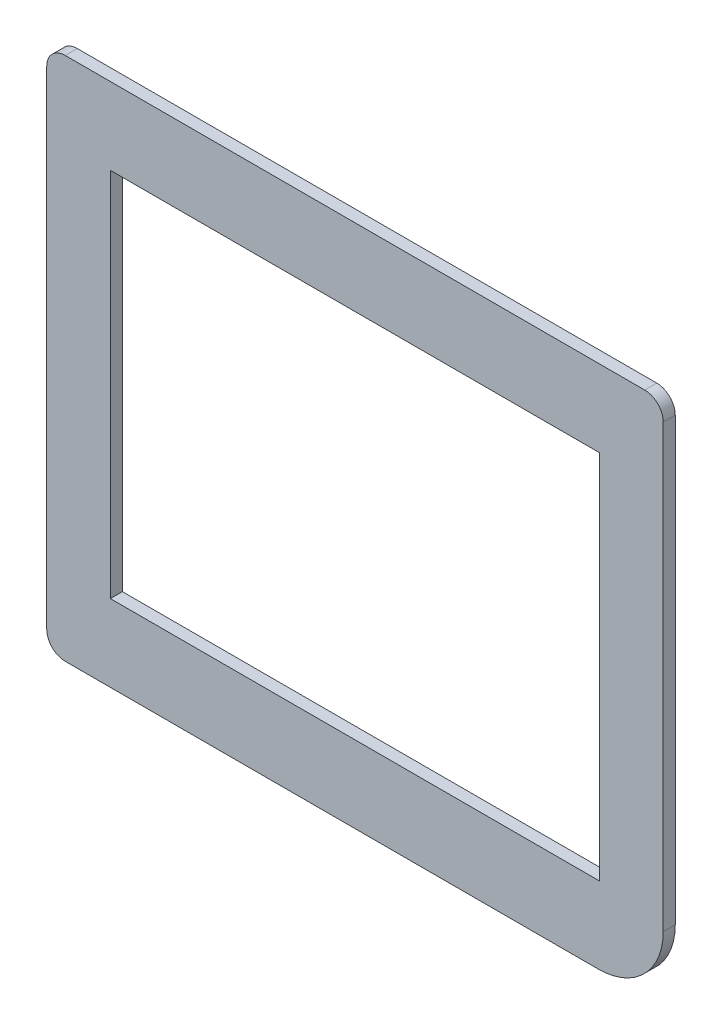
ISO-10303-21;
HEADER;
FILE_DESCRIPTION(('STEP AP214'),'2;1');
FILE_NAME('part.step','',(''),(''),'','','');
FILE_SCHEMA(('AUTOMOTIVE_DESIGN { 1 0 10303 214 1 1 1 1 }'));
ENDSEC;
DATA;
#1=APPLICATION_CONTEXT('core data for automotive mechanical design processes');
#2=APPLICATION_PROTOCOL_DEFINITION('international standard','automotive_design',2000,#1);
#3=PRODUCT_CONTEXT('',#1,'mechanical');
#4=PRODUCT('Part','Part','',(#3));
#5=PRODUCT_RELATED_PRODUCT_CATEGORY('part','',(#4));
#6=PRODUCT_DEFINITION_FORMATION('','',#4);
#7=PRODUCT_DEFINITION_CONTEXT('part definition',#1,'design');
#8=PRODUCT_DEFINITION('design','',#6,#7);
#9=PRODUCT_DEFINITION_SHAPE('','',#8);
#10=(LENGTH_UNIT() NAMED_UNIT(*) SI_UNIT(.MILLI.,.METRE.));
#11=(NAMED_UNIT(*) PLANE_ANGLE_UNIT() SI_UNIT($,.RADIAN.));
#12=(NAMED_UNIT(*) SI_UNIT($,.STERADIAN.) SOLID_ANGLE_UNIT());
#13=UNCERTAINTY_MEASURE_WITH_UNIT(LENGTH_MEASURE(1.E-05),#10,'distance_accuracy_value','');
#14=(GEOMETRIC_REPRESENTATION_CONTEXT(3) GLOBAL_UNCERTAINTY_ASSIGNED_CONTEXT((#13)) GLOBAL_UNIT_ASSIGNED_CONTEXT((#10,
#11,#12)) REPRESENTATION_CONTEXT('',''));
#15=CARTESIAN_POINT('',(0.,0.,0.));
#16=DIRECTION('',(0.,0.,1.));
#17=DIRECTION('',(1.,0.,0.));
#18=AXIS2_PLACEMENT_3D('',#15,#16,#17);
#19=CARTESIAN_POINT('',(26.31,-21.35,1.3));
#20=DIRECTION('',(0.,0.,-1.));
#21=DIRECTION('',(-1.,0.,0.));
#22=AXIS2_PLACEMENT_3D('',#19,#20,#21);
#23=CYLINDRICAL_SURFACE('',#22,7.);
#24=CARTESIAN_POINT('',(26.31,-21.35,0.));
#25=DIRECTION('',(0.,0.,1.));
#26=DIRECTION('',(1.,0.,0.));
#27=AXIS2_PLACEMENT_3D('',#24,#25,#26);
#28=CIRCLE('',#27,7.);
#29=CARTESIAN_POINT('',(26.31,-28.35,0.));
#30=VERTEX_POINT('',#29);
#31=CARTESIAN_POINT('',(33.31,-21.35,0.));
#32=VERTEX_POINT('',#31);
#33=EDGE_CURVE('E154',#30,#32,#28,.T.);
#34=ORIENTED_EDGE('',*,*,#33,.T.);
#35=DIRECTION('',(0.,0.,-1.));
#36=VECTOR('',#35,1.);
#37=CARTESIAN_POINT('',(33.31,-21.35,1.3));
#38=LINE('',#37,#36);
#39=CARTESIAN_POINT('',(33.31,-21.35,1.3));
#40=VERTEX_POINT('',#39);
#41=EDGE_CURVE('E11',#40,#32,#38,.T.);
#42=ORIENTED_EDGE('',*,*,#41,.F.);
#43=CARTESIAN_POINT('',(26.31,-21.35,1.3));
#44=DIRECTION('',(0.,0.,1.));
#45=DIRECTION('',(1.,0.,0.));
#46=AXIS2_PLACEMENT_3D('',#43,#44,#45);
#47=CIRCLE('',#46,7.);
#48=CARTESIAN_POINT('',(26.31,-28.35,1.3));
#49=VERTEX_POINT('',#48);
#50=EDGE_CURVE('E158',#49,#40,#47,.T.);
#51=ORIENTED_EDGE('',*,*,#50,.F.);
#52=DIRECTION('',(0.,0.,-1.));
#53=VECTOR('',#52,1.);
#54=CARTESIAN_POINT('',(26.31,-28.35,1.3));
#55=LINE('',#54,#53);
#56=EDGE_CURVE('E176',#49,#30,#55,.T.);
#57=ORIENTED_EDGE('',*,*,#56,.T.);
#58=EDGE_LOOP('',(#34,#42,#51,#57));
#59=FACE_BOUND('',#58,.T.);
#60=ADVANCED_FACE('F33',(#59),#23,.T.);
#61=CARTESIAN_POINT('',(33.31,26.35,1.3));
#62=DIRECTION('',(-1.,0.,0.));
#63=DIRECTION('',(0.,-1.,0.));
#64=AXIS2_PLACEMENT_3D('',#61,#62,#63);
#65=PLANE('',#64);
#66=DIRECTION('',(0.,1.,0.));
#67=VECTOR('',#66,1.);
#68=CARTESIAN_POINT('',(33.31,26.35,0.));
#69=LINE('',#68,#67);
#70=CARTESIAN_POINT('',(33.31,26.35,0.));
#71=VERTEX_POINT('',#70);
#72=EDGE_CURVE('E179',#32,#71,#69,.T.);
#73=ORIENTED_EDGE('',*,*,#72,.T.);
#74=DIRECTION('',(0.,0.,-1.));
#75=VECTOR('',#74,1.);
#76=CARTESIAN_POINT('',(33.31,26.35,1.3));
#77=LINE('',#76,#75);
#78=CARTESIAN_POINT('',(33.31,26.35,1.3));
#79=VERTEX_POINT('',#78);
#80=EDGE_CURVE('E40',#79,#71,#77,.T.);
#81=ORIENTED_EDGE('',*,*,#80,.F.);
#82=DIRECTION('',(0.,1.,0.));
#83=VECTOR('',#82,1.);
#84=CARTESIAN_POINT('',(33.31,26.35,1.3));
#85=LINE('',#84,#83);
#86=EDGE_CURVE('E161',#40,#79,#85,.T.);
#87=ORIENTED_EDGE('',*,*,#86,.F.);
#88=ORIENTED_EDGE('',*,*,#41,.T.);
#89=EDGE_LOOP('',(#73,#81,#87,#88));
#90=FACE_BOUND('',#89,.T.);
#91=ADVANCED_FACE('F234',(#90),#65,.F.);
#92=CARTESIAN_POINT('',(31.31,26.35,1.3));
#93=DIRECTION('',(0.,0.,-1.));
#94=DIRECTION('',(-1.,0.,0.));
#95=AXIS2_PLACEMENT_3D('',#92,#93,#94);
#96=CYLINDRICAL_SURFACE('',#95,2.00000000000001);
#97=CARTESIAN_POINT('',(31.31,26.35,0.));
#98=DIRECTION('',(0.,0.,1.));
#99=DIRECTION('',(-1.,0.,0.));
#100=AXIS2_PLACEMENT_3D('',#97,#98,#99);
#101=CIRCLE('',#100,2.00000000000001);
#102=CARTESIAN_POINT('',(31.31,28.35,0.));
#103=VERTEX_POINT('',#102);
#104=EDGE_CURVE('E181',#71,#103,#101,.T.);
#105=ORIENTED_EDGE('',*,*,#104,.T.);
#106=DIRECTION('',(0.,0.,-1.));
#107=VECTOR('',#106,1.);
#108=CARTESIAN_POINT('',(31.31,28.35,1.3));
#109=LINE('',#108,#107);
#110=CARTESIAN_POINT('',(31.31,28.35,1.3));
#111=VERTEX_POINT('',#110);
#112=EDGE_CURVE('E206',#111,#103,#109,.T.);
#113=ORIENTED_EDGE('',*,*,#112,.F.);
#114=CARTESIAN_POINT('',(31.31,26.35,1.3));
#115=DIRECTION('',(0.,0.,1.));
#116=DIRECTION('',(-1.,0.,0.));
#117=AXIS2_PLACEMENT_3D('',#114,#115,#116);
#118=CIRCLE('',#117,2.00000000000001);
#119=EDGE_CURVE('E164',#79,#111,#118,.T.);
#120=ORIENTED_EDGE('',*,*,#119,.F.);
#121=ORIENTED_EDGE('',*,*,#80,.T.);
#122=EDGE_LOOP('',(#105,#113,#120,#121));
#123=FACE_BOUND('',#122,.T.);
#124=ADVANCED_FACE('F213',(#123),#96,.T.);
#125=CARTESIAN_POINT('',(-31.31,28.35,1.3));
#126=DIRECTION('',(0.,-1.,0.));
#127=DIRECTION('',(1.,0.,0.));
#128=AXIS2_PLACEMENT_3D('',#125,#126,#127);
#129=PLANE('',#128);
#130=DIRECTION('',(-1.,0.,0.));
#131=VECTOR('',#130,1.);
#132=CARTESIAN_POINT('',(-31.31,28.35,0.));
#133=LINE('',#132,#131);
#134=CARTESIAN_POINT('',(-31.31,28.35,0.));
#135=VERTEX_POINT('',#134);
#136=EDGE_CURVE('E183',#103,#135,#133,.T.);
#137=ORIENTED_EDGE('',*,*,#136,.T.);
#138=DIRECTION('',(0.,0.,-1.));
#139=VECTOR('',#138,1.);
#140=CARTESIAN_POINT('',(-31.31,28.35,1.3));
#141=LINE('',#140,#139);
#142=CARTESIAN_POINT('',(-31.31,28.35,1.3));
#143=VERTEX_POINT('',#142);
#144=EDGE_CURVE('E203',#143,#135,#141,.T.);
#145=ORIENTED_EDGE('',*,*,#144,.F.);
#146=DIRECTION('',(-1.,0.,0.));
#147=VECTOR('',#146,1.);
#148=CARTESIAN_POINT('',(-31.31,28.35,1.3));
#149=LINE('',#148,#147);
#150=EDGE_CURVE('E166',#111,#143,#149,.T.);
#151=ORIENTED_EDGE('',*,*,#150,.F.);
#152=ORIENTED_EDGE('',*,*,#112,.T.);
#153=EDGE_LOOP('',(#137,#145,#151,#152));
#154=FACE_BOUND('',#153,.T.);
#155=ADVANCED_FACE('F224',(#154),#129,.F.);
#156=CARTESIAN_POINT('',(-31.31,26.35,1.3));
#157=DIRECTION('',(0.,0.,-1.));
#158=DIRECTION('',(-1.,0.,0.));
#159=AXIS2_PLACEMENT_3D('',#156,#157,#158);
#160=CYLINDRICAL_SURFACE('',#159,2.00000000000001);
#161=CARTESIAN_POINT('',(-31.31,26.35,0.));
#162=DIRECTION('',(0.,0.,1.));
#163=DIRECTION('',(1.,0.,0.));
#164=AXIS2_PLACEMENT_3D('',#161,#162,#163);
#165=CIRCLE('',#164,2.00000000000001);
#166=CARTESIAN_POINT('',(-33.31,26.35,0.));
#167=VERTEX_POINT('',#166);
#168=EDGE_CURVE('E185',#135,#167,#165,.T.);
#169=ORIENTED_EDGE('',*,*,#168,.T.);
#170=DIRECTION('',(0.,0.,-1.));
#171=VECTOR('',#170,1.);
#172=CARTESIAN_POINT('',(-33.31,26.35,1.3));
#173=LINE('',#172,#171);
#174=CARTESIAN_POINT('',(-33.31,26.35,1.3));
#175=VERTEX_POINT('',#174);
#176=EDGE_CURVE('E200',#175,#167,#173,.T.);
#177=ORIENTED_EDGE('',*,*,#176,.F.);
#178=CARTESIAN_POINT('',(-31.31,26.35,1.3));
#179=DIRECTION('',(0.,0.,1.));
#180=DIRECTION('',(1.,0.,0.));
#181=AXIS2_PLACEMENT_3D('',#178,#179,#180);
#182=CIRCLE('',#181,2.00000000000001);
#183=EDGE_CURVE('E168',#143,#175,#182,.T.);
#184=ORIENTED_EDGE('',*,*,#183,.F.);
#185=ORIENTED_EDGE('',*,*,#144,.T.);
#186=EDGE_LOOP('',(#169,#177,#184,#185));
#187=FACE_BOUND('',#186,.T.);
#188=ADVANCED_FACE('F228',(#187),#160,.T.);
#189=CARTESIAN_POINT('',(-33.31,26.35,1.3));
#190=DIRECTION('',(1.,0.,0.));
#191=DIRECTION('',(0.,1.,0.));
#192=AXIS2_PLACEMENT_3D('',#189,#190,#191);
#193=PLANE('',#192);
#194=DIRECTION('',(0.,-1.,0.));
#195=VECTOR('',#194,1.);
#196=CARTESIAN_POINT('',(-33.31,26.35,0.));
#197=LINE('',#196,#195);
#198=CARTESIAN_POINT('',(-33.31,-26.35,0.));
#199=VERTEX_POINT('',#198);
#200=EDGE_CURVE('E187',#167,#199,#197,.T.);
#201=ORIENTED_EDGE('',*,*,#200,.T.);
#202=DIRECTION('',(0.,0.,-1.));
#203=VECTOR('',#202,1.);
#204=CARTESIAN_POINT('',(-33.31,-26.35,1.3));
#205=LINE('',#204,#203);
#206=CARTESIAN_POINT('',(-33.31,-26.35,1.3));
#207=VERTEX_POINT('',#206);
#208=EDGE_CURVE('E197',#207,#199,#205,.T.);
#209=ORIENTED_EDGE('',*,*,#208,.F.);
#210=DIRECTION('',(0.,-1.,0.));
#211=VECTOR('',#210,1.);
#212=CARTESIAN_POINT('',(-33.31,26.35,1.3));
#213=LINE('',#212,#211);
#214=EDGE_CURVE('E170',#175,#207,#213,.T.);
#215=ORIENTED_EDGE('',*,*,#214,.F.);
#216=ORIENTED_EDGE('',*,*,#176,.T.);
#217=EDGE_LOOP('',(#201,#209,#215,#216));
#218=FACE_BOUND('',#217,.T.);
#219=ADVANCED_FACE('F247',(#218),#193,.F.);
#220=CARTESIAN_POINT('',(-31.31,-26.35,1.3));
#221=DIRECTION('',(0.,0.,-1.));
#222=DIRECTION('',(-1.,0.,0.));
#223=AXIS2_PLACEMENT_3D('',#220,#221,#222);
#224=CYLINDRICAL_SURFACE('',#223,2.00000000000001);
#225=CARTESIAN_POINT('',(-31.31,-26.35,0.));
#226=DIRECTION('',(0.,0.,1.));
#227=DIRECTION('',(1.,0.,0.));
#228=AXIS2_PLACEMENT_3D('',#225,#226,#227);
#229=CIRCLE('',#228,2.00000000000001);
#230=CARTESIAN_POINT('',(-31.31,-28.35,0.));
#231=VERTEX_POINT('',#230);
#232=EDGE_CURVE('E189',#199,#231,#229,.T.);
#233=ORIENTED_EDGE('',*,*,#232,.T.);
#234=DIRECTION('',(0.,0.,-1.));
#235=VECTOR('',#234,1.);
#236=CARTESIAN_POINT('',(-31.31,-28.35,1.3));
#237=LINE('',#236,#235);
#238=CARTESIAN_POINT('',(-31.31,-28.35,1.3));
#239=VERTEX_POINT('',#238);
#240=EDGE_CURVE('E194',#239,#231,#237,.T.);
#241=ORIENTED_EDGE('',*,*,#240,.F.);
#242=CARTESIAN_POINT('',(-31.31,-26.35,1.3));
#243=DIRECTION('',(0.,0.,1.));
#244=DIRECTION('',(1.,0.,0.));
#245=AXIS2_PLACEMENT_3D('',#242,#243,#244);
#246=CIRCLE('',#245,2.00000000000001);
#247=EDGE_CURVE('E172',#207,#239,#246,.T.);
#248=ORIENTED_EDGE('',*,*,#247,.F.);
#249=ORIENTED_EDGE('',*,*,#208,.T.);
#250=EDGE_LOOP('',(#233,#241,#248,#249));
#251=FACE_BOUND('',#250,.T.);
#252=ADVANCED_FACE('F245',(#251),#224,.T.);
#253=CARTESIAN_POINT('',(-31.31,-28.35,1.3));
#254=DIRECTION('',(0.,1.,0.));
#255=DIRECTION('',(-1.,0.,0.));
#256=AXIS2_PLACEMENT_3D('',#253,#254,#255);
#257=PLANE('',#256);
#258=DIRECTION('',(1.,0.,0.));
#259=VECTOR('',#258,1.);
#260=CARTESIAN_POINT('',(-31.31,-28.35,0.));
#261=LINE('',#260,#259);
#262=EDGE_CURVE('E162',#231,#30,#261,.T.);
#263=ORIENTED_EDGE('',*,*,#262,.T.);
#264=ORIENTED_EDGE('',*,*,#56,.F.);
#265=DIRECTION('',(1.,0.,0.));
#266=VECTOR('',#265,1.);
#267=CARTESIAN_POINT('',(-31.31,-28.35,1.3));
#268=LINE('',#267,#266);
#269=EDGE_CURVE('E174',#239,#49,#268,.T.);
#270=ORIENTED_EDGE('',*,*,#269,.F.);
#271=ORIENTED_EDGE('',*,*,#240,.T.);
#272=EDGE_LOOP('',(#263,#264,#270,#271));
#273=FACE_BOUND('',#272,.T.);
#274=ADVANCED_FACE('F240',(#273),#257,.F.);
#275=CARTESIAN_POINT('',(26.31,-21.35,1.3));
#276=DIRECTION('',(0.,0.,1.));
#277=DIRECTION('',(1.,0.,0.));
#278=AXIS2_PLACEMENT_3D('',#275,#276,#277);
#279=PLANE('',#278);
#280=DIRECTION('',(0.,-1.,0.));
#281=VECTOR('',#280,1.);
#282=CARTESIAN_POINT('',(26.44,-20.04,1.3));
#283=LINE('',#282,#281);
#284=CARTESIAN_POINT('',(26.44,20.04,1.3));
#285=VERTEX_POINT('',#284);
#286=CARTESIAN_POINT('',(26.44,-20.04,1.3));
#287=VERTEX_POINT('',#286);
#288=EDGE_CURVE('E123',#285,#287,#283,.T.);
#289=ORIENTED_EDGE('',*,*,#288,.T.);
#290=DIRECTION('',(-1.,0.,0.));
#291=VECTOR('',#290,1.);
#292=CARTESIAN_POINT('',(-26.44,-20.04,1.3));
#293=LINE('',#292,#291);
#294=CARTESIAN_POINT('',(-26.44,-20.04,1.3));
#295=VERTEX_POINT('',#294);
#296=EDGE_CURVE('E132',#287,#295,#293,.T.);
#297=ORIENTED_EDGE('',*,*,#296,.T.);
#298=DIRECTION('',(0.,1.,0.));
#299=VECTOR('',#298,1.);
#300=CARTESIAN_POINT('',(-26.44,-20.04,1.3));
#301=LINE('',#300,#299);
#302=CARTESIAN_POINT('',(-26.44,20.04,1.3));
#303=VERTEX_POINT('',#302);
#304=EDGE_CURVE('E47',#295,#303,#301,.T.);
#305=ORIENTED_EDGE('',*,*,#304,.T.);
#306=DIRECTION('',(1.,0.,0.));
#307=VECTOR('',#306,1.);
#308=CARTESIAN_POINT('',(-26.44,20.04,1.3));
#309=LINE('',#308,#307);
#310=EDGE_CURVE('E129',#303,#285,#309,.T.);
#311=ORIENTED_EDGE('',*,*,#310,.T.);
#312=EDGE_LOOP('',(#289,#297,#305,#311));
#313=FACE_BOUND('',#312,.T.);
#314=ORIENTED_EDGE('',*,*,#50,.T.);
#315=ORIENTED_EDGE('',*,*,#86,.T.);
#316=ORIENTED_EDGE('',*,*,#119,.T.);
#317=ORIENTED_EDGE('',*,*,#150,.T.);
#318=ORIENTED_EDGE('',*,*,#183,.T.);
#319=ORIENTED_EDGE('',*,*,#214,.T.);
#320=ORIENTED_EDGE('',*,*,#247,.T.);
#321=ORIENTED_EDGE('',*,*,#269,.T.);
#322=EDGE_LOOP('',(#314,#315,#316,#317,#318,#319,#320,#321));
#323=FACE_BOUND('',#322,.T.);
#324=ADVANCED_FACE('F136',(#313,#323),#279,.T.);
#325=CARTESIAN_POINT('',(26.31,-21.35,0.));
#326=DIRECTION('',(0.,0.,1.));
#327=DIRECTION('',(1.,0.,0.));
#328=AXIS2_PLACEMENT_3D('',#325,#326,#327);
#329=PLANE('',#328);
#330=DIRECTION('',(-1.,0.,0.));
#331=VECTOR('',#330,1.);
#332=CARTESIAN_POINT('',(-26.44,-20.04,0.));
#333=LINE('',#332,#331);
#334=CARTESIAN_POINT('',(26.44,-20.04,0.));
#335=VERTEX_POINT('',#334);
#336=CARTESIAN_POINT('',(-26.44,-20.04,0.));
#337=VERTEX_POINT('',#336);
#338=EDGE_CURVE('E148',#335,#337,#333,.T.);
#339=ORIENTED_EDGE('',*,*,#338,.F.);
#340=DIRECTION('',(0.,-1.,0.));
#341=VECTOR('',#340,1.);
#342=CARTESIAN_POINT('',(26.44,-20.04,0.));
#343=LINE('',#342,#341);
#344=CARTESIAN_POINT('',(26.44,20.04,0.));
#345=VERTEX_POINT('',#344);
#346=EDGE_CURVE('E55',#345,#335,#343,.T.);
#347=ORIENTED_EDGE('',*,*,#346,.F.);
#348=DIRECTION('',(1.,0.,0.));
#349=VECTOR('',#348,1.);
#350=CARTESIAN_POINT('',(-26.44,20.04,0.));
#351=LINE('',#350,#349);
#352=CARTESIAN_POINT('',(-26.44,20.04,0.));
#353=VERTEX_POINT('',#352);
#354=EDGE_CURVE('E139',#353,#345,#351,.T.);
#355=ORIENTED_EDGE('',*,*,#354,.F.);
#356=DIRECTION('',(0.,1.,0.));
#357=VECTOR('',#356,1.);
#358=CARTESIAN_POINT('',(-26.44,-20.04,0.));
#359=LINE('',#358,#357);
#360=EDGE_CURVE('E142',#337,#353,#359,.T.);
#361=ORIENTED_EDGE('',*,*,#360,.F.);
#362=EDGE_LOOP('',(#339,#347,#355,#361));
#363=FACE_BOUND('',#362,.T.);
#364=ORIENTED_EDGE('',*,*,#33,.F.);
#365=ORIENTED_EDGE('',*,*,#262,.F.);
#366=ORIENTED_EDGE('',*,*,#232,.F.);
#367=ORIENTED_EDGE('',*,*,#200,.F.);
#368=ORIENTED_EDGE('',*,*,#168,.F.);
#369=ORIENTED_EDGE('',*,*,#136,.F.);
#370=ORIENTED_EDGE('',*,*,#104,.F.);
#371=ORIENTED_EDGE('',*,*,#72,.F.);
#372=EDGE_LOOP('',(#364,#365,#366,#367,#368,#369,#370,#371));
#373=FACE_BOUND('',#372,.T.);
#374=ADVANCED_FACE('F219',(#363,#373),#329,.F.);
#375=CARTESIAN_POINT('',(26.44,-20.04,1.3));
#376=DIRECTION('',(1.,0.,0.));
#377=DIRECTION('',(0.,0.,-1.));
#378=AXIS2_PLACEMENT_3D('',#375,#376,#377);
#379=PLANE('',#378);
#380=ORIENTED_EDGE('',*,*,#346,.T.);
#381=DIRECTION('',(0.,0.,-1.));
#382=VECTOR('',#381,1.);
#383=CARTESIAN_POINT('',(26.44,-20.04,1.3));
#384=LINE('',#383,#382);
#385=EDGE_CURVE('E119',#287,#335,#384,.T.);
#386=ORIENTED_EDGE('',*,*,#385,.F.);
#387=ORIENTED_EDGE('',*,*,#288,.F.);
#388=DIRECTION('',(0.,0.,-1.));
#389=VECTOR('',#388,1.);
#390=CARTESIAN_POINT('',(26.44,20.04,1.3));
#391=LINE('',#390,#389);
#392=EDGE_CURVE('E152',#285,#345,#391,.T.);
#393=ORIENTED_EDGE('',*,*,#392,.T.);
#394=EDGE_LOOP('',(#380,#386,#387,#393));
#395=FACE_BOUND('',#394,.T.);
#396=ADVANCED_FACE('F121',(#395),#379,.F.);
#397=CARTESIAN_POINT('',(-26.44,20.04,1.3));
#398=DIRECTION('',(0.,1.,0.));
#399=DIRECTION('',(0.,0.,1.));
#400=AXIS2_PLACEMENT_3D('',#397,#398,#399);
#401=PLANE('',#400);
#402=ORIENTED_EDGE('',*,*,#354,.T.);
#403=ORIENTED_EDGE('',*,*,#392,.F.);
#404=ORIENTED_EDGE('',*,*,#310,.F.);
#405=DIRECTION('',(0.,0.,-1.));
#406=VECTOR('',#405,1.);
#407=CARTESIAN_POINT('',(-26.44,20.04,1.3));
#408=LINE('',#407,#406);
#409=EDGE_CURVE('E155',#303,#353,#408,.T.);
#410=ORIENTED_EDGE('',*,*,#409,.T.);
#411=EDGE_LOOP('',(#402,#403,#404,#410));
#412=FACE_BOUND('',#411,.T.);
#413=ADVANCED_FACE('F314',(#412),#401,.F.);
#414=CARTESIAN_POINT('',(-26.44,-20.04,1.3));
#415=DIRECTION('',(-1.,0.,0.));
#416=DIRECTION('',(0.,0.,1.));
#417=AXIS2_PLACEMENT_3D('',#414,#415,#416);
#418=PLANE('',#417);
#419=ORIENTED_EDGE('',*,*,#360,.T.);
#420=ORIENTED_EDGE('',*,*,#409,.F.);
#421=ORIENTED_EDGE('',*,*,#304,.F.);
#422=DIRECTION('',(0.,0.,-1.));
#423=VECTOR('',#422,1.);
#424=CARTESIAN_POINT('',(-26.44,-20.04,1.3));
#425=LINE('',#424,#423);
#426=EDGE_CURVE('E128',#295,#337,#425,.T.);
#427=ORIENTED_EDGE('',*,*,#426,.T.);
#428=EDGE_LOOP('',(#419,#420,#421,#427));
#429=FACE_BOUND('',#428,.T.);
#430=ADVANCED_FACE('F323',(#429),#418,.F.);
#431=CARTESIAN_POINT('',(-26.44,-20.04,1.3));
#432=DIRECTION('',(0.,-1.,0.));
#433=DIRECTION('',(0.,0.,-1.));
#434=AXIS2_PLACEMENT_3D('',#431,#432,#433);
#435=PLANE('',#434);
#436=ORIENTED_EDGE('',*,*,#338,.T.);
#437=ORIENTED_EDGE('',*,*,#426,.F.);
#438=ORIENTED_EDGE('',*,*,#296,.F.);
#439=ORIENTED_EDGE('',*,*,#385,.T.);
#440=EDGE_LOOP('',(#436,#437,#438,#439));
#441=FACE_BOUND('',#440,.T.);
#442=ADVANCED_FACE('F133',(#441),#435,.F.);
#443=CLOSED_SHELL('',(#60,#91,#124,#155,#188,#219,#252,#274,#324,#374,#396,#413,#430,#442));
#444=MANIFOLD_SOLID_BREP('B2',#443);
#445=ADVANCED_BREP_SHAPE_REPRESENTATION('',(#18,#444),#14);
#446=SHAPE_DEFINITION_REPRESENTATION(#9,#445);
ENDSEC;
END-ISO-10303-21;
